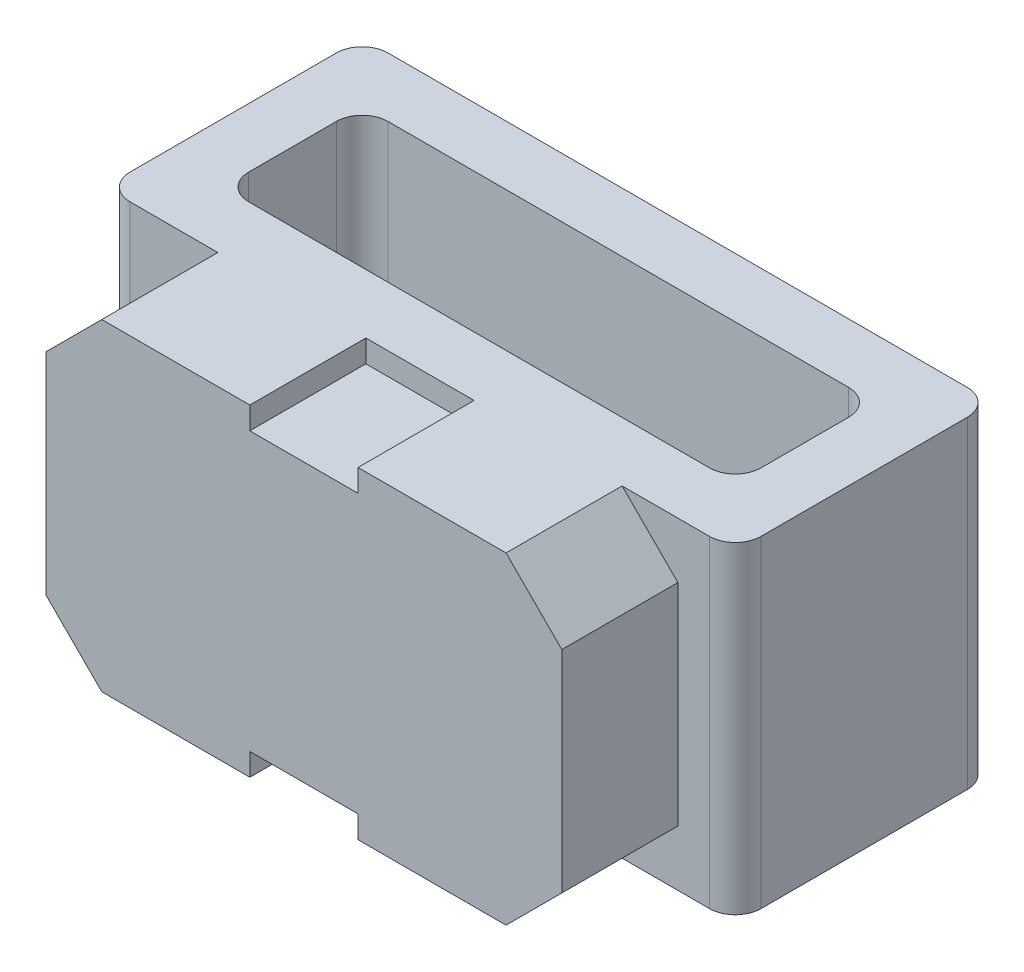
ISO-10303-21;
HEADER;
FILE_DESCRIPTION(('STEP AP214'),'2;1');
FILE_NAME('part.step','',(''),(''),'','','');
FILE_SCHEMA(('AUTOMOTIVE_DESIGN { 1 0 10303 214 1 1 1 1 }'));
ENDSEC;
DATA;
#1=APPLICATION_CONTEXT('core data for automotive mechanical design processes');
#2=APPLICATION_PROTOCOL_DEFINITION('international standard','automotive_design',2000,#1);
#3=PRODUCT_CONTEXT('',#1,'mechanical');
#4=PRODUCT('Part','Part','',(#3));
#5=PRODUCT_RELATED_PRODUCT_CATEGORY('part','',(#4));
#6=PRODUCT_DEFINITION_FORMATION('','',#4);
#7=PRODUCT_DEFINITION_CONTEXT('part definition',#1,'design');
#8=PRODUCT_DEFINITION('design','',#6,#7);
#9=PRODUCT_DEFINITION_SHAPE('','',#8);
#10=(LENGTH_UNIT() NAMED_UNIT(*) SI_UNIT(.MILLI.,.METRE.));
#11=(NAMED_UNIT(*) PLANE_ANGLE_UNIT() SI_UNIT($,.RADIAN.));
#12=(NAMED_UNIT(*) SI_UNIT($,.STERADIAN.) SOLID_ANGLE_UNIT());
#13=UNCERTAINTY_MEASURE_WITH_UNIT(LENGTH_MEASURE(1.E-05),#10,'distance_accuracy_value','');
#14=(GEOMETRIC_REPRESENTATION_CONTEXT(3) GLOBAL_UNCERTAINTY_ASSIGNED_CONTEXT((#13)) GLOBAL_UNIT_ASSIGNED_CONTEXT((#10,
#11,#12)) REPRESENTATION_CONTEXT('',''));
#15=CARTESIAN_POINT('',(0.,0.,0.));
#16=DIRECTION('',(0.,0.,1.));
#17=DIRECTION('',(1.,0.,0.));
#18=AXIS2_PLACEMENT_3D('',#15,#16,#17);
#19=CARTESIAN_POINT('',(0.209757082518002,0.625,0.45));
#20=DIRECTION('',(1.,0.,0.));
#21=DIRECTION('',(0.,1.,0.));
#22=AXIS2_PLACEMENT_3D('',#19,#20,#21);
#23=PLANE('',#22);
#24=DIRECTION('',(0.,-1.,0.));
#25=VECTOR('',#24,1.);
#26=CARTESIAN_POINT('',(0.209757082518002,0.625,0.));
#27=LINE('',#26,#25);
#28=CARTESIAN_POINT('',(0.209757082518002,0.625,0.));
#29=VERTEX_POINT('',#28);
#30=CARTESIAN_POINT('',(0.209757082518002,0.538272510111284,0.));
#31=VERTEX_POINT('',#30);
#32=EDGE_CURVE('E413',#29,#31,#27,.T.);
#33=ORIENTED_EDGE('',*,*,#32,.T.);
#34=DIRECTION('',(0.,0.,-1.));
#35=VECTOR('',#34,1.);
#36=CARTESIAN_POINT('',(0.209757082518002,0.538272510111284,0.45));
#37=LINE('',#36,#35);
#38=CARTESIAN_POINT('',(0.209757082518002,0.538272510111284,0.45));
#39=VERTEX_POINT('',#38);
#40=EDGE_CURVE('E293',#39,#31,#37,.T.);
#41=ORIENTED_EDGE('',*,*,#40,.F.);
#42=DIRECTION('',(0.,-1.,0.));
#43=VECTOR('',#42,1.);
#44=CARTESIAN_POINT('',(0.209757082518002,0.625,0.45));
#45=LINE('',#44,#43);
#46=CARTESIAN_POINT('',(0.209757082518002,0.625,0.45));
#47=VERTEX_POINT('',#46);
#48=EDGE_CURVE('E422',#47,#39,#45,.T.);
#49=ORIENTED_EDGE('',*,*,#48,.F.);
#50=DIRECTION('',(0.,0.,-1.));
#51=VECTOR('',#50,1.);
#52=CARTESIAN_POINT('',(0.209757082518002,0.625,0.45));
#53=LINE('',#52,#51);
#54=EDGE_CURVE('E455',#47,#29,#53,.T.);
#55=ORIENTED_EDGE('',*,*,#54,.T.);
#56=EDGE_LOOP('',(#33,#41,#49,#55));
#57=FACE_BOUND('',#56,.T.);
#58=ADVANCED_FACE('F33',(#57),#23,.F.);
#59=CARTESIAN_POINT('',(-0.209757082518002,0.538272510111284,0.45));
#60=DIRECTION('',(0.,-1.,0.));
#61=DIRECTION('',(0.,0.,-1.));
#62=AXIS2_PLACEMENT_3D('',#59,#60,#61);
#63=PLANE('',#62);
#64=DIRECTION('',(-1.,0.,0.));
#65=VECTOR('',#64,1.);
#66=CARTESIAN_POINT('',(-0.209757082518002,0.538272510111284,0.));
#67=LINE('',#66,#65);
#68=CARTESIAN_POINT('',(-0.209757082518002,0.538272510111284,0.));
#69=VERTEX_POINT('',#68);
#70=EDGE_CURVE('E458',#31,#69,#67,.T.);
#71=ORIENTED_EDGE('',*,*,#70,.T.);
#72=DIRECTION('',(0.,0.,-1.));
#73=VECTOR('',#72,1.);
#74=CARTESIAN_POINT('',(-0.209757082518002,0.538272510111284,0.45));
#75=LINE('',#74,#73);
#76=CARTESIAN_POINT('',(-0.209757082518002,0.538272510111284,0.45));
#77=VERTEX_POINT('',#76);
#78=EDGE_CURVE('E290',#77,#69,#75,.T.);
#79=ORIENTED_EDGE('',*,*,#78,.F.);
#80=DIRECTION('',(-1.,0.,0.));
#81=VECTOR('',#80,1.);
#82=CARTESIAN_POINT('',(-0.209757082518002,0.538272510111284,0.45));
#83=LINE('',#82,#81);
#84=EDGE_CURVE('E425',#39,#77,#83,.T.);
#85=ORIENTED_EDGE('',*,*,#84,.F.);
#86=ORIENTED_EDGE('',*,*,#40,.T.);
#87=EDGE_LOOP('',(#71,#79,#85,#86));
#88=FACE_BOUND('',#87,.T.);
#89=ADVANCED_FACE('F556',(#88),#63,.F.);
#90=CARTESIAN_POINT('',(-0.209757082518002,0.625,0.45));
#91=DIRECTION('',(-1.,0.,0.));
#92=DIRECTION('',(0.,-1.,0.));
#93=AXIS2_PLACEMENT_3D('',#90,#91,#92);
#94=PLANE('',#93);
#95=DIRECTION('',(0.,1.,0.));
#96=VECTOR('',#95,1.);
#97=CARTESIAN_POINT('',(-0.209757082518002,0.625,0.));
#98=LINE('',#97,#96);
#99=CARTESIAN_POINT('',(-0.209757082518002,0.625,0.));
#100=VERTEX_POINT('',#99);
#101=EDGE_CURVE('E461',#69,#100,#98,.T.);
#102=ORIENTED_EDGE('',*,*,#101,.T.);
#103=DIRECTION('',(0.,0.,-1.));
#104=VECTOR('',#103,1.);
#105=CARTESIAN_POINT('',(-0.209757082518002,0.625,0.45));
#106=LINE('',#105,#104);
#107=CARTESIAN_POINT('',(-0.209757082518002,0.625,0.45));
#108=VERTEX_POINT('',#107);
#109=EDGE_CURVE('E287',#108,#100,#106,.T.);
#110=ORIENTED_EDGE('',*,*,#109,.F.);
#111=DIRECTION('',(0.,1.,0.));
#112=VECTOR('',#111,1.);
#113=CARTESIAN_POINT('',(-0.209757082518002,0.625,0.45));
#114=LINE('',#113,#112);
#115=EDGE_CURVE('E428',#77,#108,#114,.T.);
#116=ORIENTED_EDGE('',*,*,#115,.F.);
#117=ORIENTED_EDGE('',*,*,#78,.T.);
#118=EDGE_LOOP('',(#102,#110,#116,#117));
#119=FACE_BOUND('',#118,.T.);
#120=ADVANCED_FACE('F563',(#119),#94,.F.);
#121=CARTESIAN_POINT('',(-1.,0.408686365069274,0.45));
#122=DIRECTION('',(0.707106781186546,-0.707106781186549,0.));
#123=DIRECTION('',(0.707106781186549,0.707106781186546,0.));
#124=AXIS2_PLACEMENT_3D('',#121,#122,#123);
#125=PLANE('',#124);
#126=DIRECTION('',(-0.707106781186549,-0.707106781186546,0.));
#127=VECTOR('',#126,1.);
#128=CARTESIAN_POINT('',(-1.,0.408686365069274,0.));
#129=LINE('',#128,#127);
#130=CARTESIAN_POINT('',(-0.783686365069273,0.625,0.));
#131=VERTEX_POINT('',#130);
#132=CARTESIAN_POINT('',(-1.,0.408686365069274,0.));
#133=VERTEX_POINT('',#132);
#134=EDGE_CURVE('E464',#131,#133,#129,.T.);
#135=ORIENTED_EDGE('',*,*,#134,.T.);
#136=DIRECTION('',(0.,0.,-1.));
#137=VECTOR('',#136,1.);
#138=CARTESIAN_POINT('',(-1.,0.408686365069274,0.45));
#139=LINE('',#138,#137);
#140=CARTESIAN_POINT('',(-1.,0.408686365069274,0.45));
#141=VERTEX_POINT('',#140);
#142=EDGE_CURVE('E275',#141,#133,#139,.T.);
#143=ORIENTED_EDGE('',*,*,#142,.F.);
#144=DIRECTION('',(-0.707106781186549,-0.707106781186546,0.));
#145=VECTOR('',#144,1.);
#146=CARTESIAN_POINT('',(-1.,0.408686365069274,0.45));
#147=LINE('',#146,#145);
#148=CARTESIAN_POINT('',(-0.783686365069273,0.625,0.45));
#149=VERTEX_POINT('',#148);
#150=EDGE_CURVE('E432',#149,#141,#147,.T.);
#151=ORIENTED_EDGE('',*,*,#150,.F.);
#152=DIRECTION('',(0.,0.,-1.));
#153=VECTOR('',#152,1.);
#154=CARTESIAN_POINT('',(-0.783686365069273,0.625,0.45));
#155=LINE('',#154,#153);
#156=EDGE_CURVE('E284',#149,#131,#155,.T.);
#157=ORIENTED_EDGE('',*,*,#156,.T.);
#158=EDGE_LOOP('',(#135,#143,#151,#157));
#159=FACE_BOUND('',#158,.T.);
#160=ADVANCED_FACE('F820',(#159),#125,.F.);
#161=CARTESIAN_POINT('',(-1.,-0.408686365069274,0.45));
#162=DIRECTION('',(1.,0.,0.));
#163=DIRECTION('',(0.,0.,-1.));
#164=AXIS2_PLACEMENT_3D('',#161,#162,#163);
#165=PLANE('',#164);
#166=DIRECTION('',(0.,-1.,0.));
#167=VECTOR('',#166,1.);
#168=CARTESIAN_POINT('',(-1.,-0.408686365069274,0.));
#169=LINE('',#168,#167);
#170=CARTESIAN_POINT('',(-1.,-0.408686365069274,0.));
#171=VERTEX_POINT('',#170);
#172=EDGE_CURVE('E266',#133,#171,#169,.T.);
#173=ORIENTED_EDGE('',*,*,#172,.T.);
#174=DIRECTION('',(0.,0.,-1.));
#175=VECTOR('',#174,1.);
#176=CARTESIAN_POINT('',(-1.,-0.408686365069274,0.45));
#177=LINE('',#176,#175);
#178=CARTESIAN_POINT('',(-1.,-0.408686365069274,0.45));
#179=VERTEX_POINT('',#178);
#180=EDGE_CURVE('E264',#179,#171,#177,.T.);
#181=ORIENTED_EDGE('',*,*,#180,.F.);
#182=DIRECTION('',(0.,-1.,0.));
#183=VECTOR('',#182,1.);
#184=CARTESIAN_POINT('',(-1.,-0.408686365069274,0.45));
#185=LINE('',#184,#183);
#186=EDGE_CURVE('E434',#141,#179,#185,.T.);
#187=ORIENTED_EDGE('',*,*,#186,.F.);
#188=ORIENTED_EDGE('',*,*,#142,.T.);
#189=EDGE_LOOP('',(#173,#181,#187,#188));
#190=FACE_BOUND('',#189,.T.);
#191=ADVANCED_FACE('F811',(#190),#165,.F.);
#192=CARTESIAN_POINT('',(-1.,-0.408686365069274,0.45));
#193=DIRECTION('',(0.707106781186546,0.707106781186549,0.));
#194=DIRECTION('',(-0.707106781186549,0.707106781186546,0.));
#195=AXIS2_PLACEMENT_3D('',#192,#193,#194);
#196=PLANE('',#195);
#197=DIRECTION('',(0.707106781186549,-0.707106781186546,0.));
#198=VECTOR('',#197,1.);
#199=CARTESIAN_POINT('',(-1.,-0.408686365069274,0.));
#200=LINE('',#199,#198);
#201=CARTESIAN_POINT('',(-0.783686365069273,-0.625,0.));
#202=VERTEX_POINT('',#201);
#203=EDGE_CURVE('E246',#171,#202,#200,.T.);
#204=ORIENTED_EDGE('',*,*,#203,.T.);
#205=DIRECTION('',(0.,0.,-1.));
#206=VECTOR('',#205,1.);
#207=CARTESIAN_POINT('',(-0.783686365069273,-0.625,0.45));
#208=LINE('',#207,#206);
#209=CARTESIAN_POINT('',(-0.783686365069273,-0.625,0.45));
#210=VERTEX_POINT('',#209);
#211=EDGE_CURVE('E261',#210,#202,#208,.T.);
#212=ORIENTED_EDGE('',*,*,#211,.F.);
#213=DIRECTION('',(0.707106781186549,-0.707106781186546,0.));
#214=VECTOR('',#213,1.);
#215=CARTESIAN_POINT('',(-1.,-0.408686365069274,0.45));
#216=LINE('',#215,#214);
#217=EDGE_CURVE('E436',#179,#210,#216,.T.);
#218=ORIENTED_EDGE('',*,*,#217,.F.);
#219=ORIENTED_EDGE('',*,*,#180,.T.);
#220=EDGE_LOOP('',(#204,#212,#218,#219));
#221=FACE_BOUND('',#220,.T.);
#222=ADVANCED_FACE('F259',(#221),#196,.F.);
#223=CARTESIAN_POINT('',(-0.209757082518002,-0.625,0.45));
#224=DIRECTION('',(-1.,0.,0.));
#225=DIRECTION('',(0.,-1.,0.));
#226=AXIS2_PLACEMENT_3D('',#223,#224,#225);
#227=PLANE('',#226);
#228=DIRECTION('',(0.,1.,0.));
#229=VECTOR('',#228,1.);
#230=CARTESIAN_POINT('',(-0.209757082518002,-0.625,0.));
#231=LINE('',#230,#229);
#232=CARTESIAN_POINT('',(-0.209757082518002,-0.625,0.));
#233=VERTEX_POINT('',#232);
#234=CARTESIAN_POINT('',(-0.209757082518002,-0.538272510111284,0.));
#235=VERTEX_POINT('',#234);
#236=EDGE_CURVE('E265',#233,#235,#231,.T.);
#237=ORIENTED_EDGE('',*,*,#236,.T.);
#238=DIRECTION('',(0.,0.,-1.));
#239=VECTOR('',#238,1.);
#240=CARTESIAN_POINT('',(-0.209757082518002,-0.538272510111284,0.45));
#241=LINE('',#240,#239);
#242=CARTESIAN_POINT('',(-0.209757082518002,-0.538272510111284,0.45));
#243=VERTEX_POINT('',#242);
#244=EDGE_CURVE('E278',#243,#235,#241,.T.);
#245=ORIENTED_EDGE('',*,*,#244,.F.);
#246=DIRECTION('',(0.,1.,0.));
#247=VECTOR('',#246,1.);
#248=CARTESIAN_POINT('',(-0.209757082518002,-0.625,0.45));
#249=LINE('',#248,#247);
#250=CARTESIAN_POINT('',(-0.209757082518002,-0.625,0.45));
#251=VERTEX_POINT('',#250);
#252=EDGE_CURVE('E439',#251,#243,#249,.T.);
#253=ORIENTED_EDGE('',*,*,#252,.F.);
#254=DIRECTION('',(0.,0.,-1.));
#255=VECTOR('',#254,1.);
#256=CARTESIAN_POINT('',(-0.209757082518002,-0.625,0.45));
#257=LINE('',#256,#255);
#258=EDGE_CURVE('E273',#251,#233,#257,.T.);
#259=ORIENTED_EDGE('',*,*,#258,.T.);
#260=EDGE_LOOP('',(#237,#245,#253,#259));
#261=FACE_BOUND('',#260,.T.);
#262=ADVANCED_FACE('F511',(#261),#227,.F.);
#263=CARTESIAN_POINT('',(-0.209757082518002,-0.538272510111284,0.45));
#264=DIRECTION('',(0.,1.,0.));
#265=DIRECTION('',(0.,0.,1.));
#266=AXIS2_PLACEMENT_3D('',#263,#264,#265);
#267=PLANE('',#266);
#268=DIRECTION('',(1.,0.,0.));
#269=VECTOR('',#268,1.);
#270=CARTESIAN_POINT('',(-0.209757082518002,-0.538272510111284,0.));
#271=LINE('',#270,#269);
#272=CARTESIAN_POINT('',(0.209757082518002,-0.538272510111284,0.));
#273=VERTEX_POINT('',#272);
#274=EDGE_CURVE('E470',#235,#273,#271,.T.);
#275=ORIENTED_EDGE('',*,*,#274,.T.);
#276=DIRECTION('',(0.,0.,-1.));
#277=VECTOR('',#276,1.);
#278=CARTESIAN_POINT('',(0.209757082518002,-0.538272510111284,0.45));
#279=LINE('',#278,#277);
#280=CARTESIAN_POINT('',(0.209757082518002,-0.538272510111284,0.45));
#281=VERTEX_POINT('',#280);
#282=EDGE_CURVE('E501',#281,#273,#279,.T.);
#283=ORIENTED_EDGE('',*,*,#282,.F.);
#284=DIRECTION('',(1.,0.,0.));
#285=VECTOR('',#284,1.);
#286=CARTESIAN_POINT('',(-0.209757082518002,-0.538272510111284,0.45));
#287=LINE('',#286,#285);
#288=EDGE_CURVE('E441',#243,#281,#287,.T.);
#289=ORIENTED_EDGE('',*,*,#288,.F.);
#290=ORIENTED_EDGE('',*,*,#244,.T.);
#291=EDGE_LOOP('',(#275,#283,#289,#290));
#292=FACE_BOUND('',#291,.T.);
#293=ADVANCED_FACE('F507',(#292),#267,.F.);
#294=CARTESIAN_POINT('',(0.209757082518002,-0.625,0.45));
#295=DIRECTION('',(1.,0.,0.));
#296=DIRECTION('',(0.,1.,0.));
#297=AXIS2_PLACEMENT_3D('',#294,#295,#296);
#298=PLANE('',#297);
#299=DIRECTION('',(0.,-1.,0.));
#300=VECTOR('',#299,1.);
#301=CARTESIAN_POINT('',(0.209757082518002,-0.625,0.));
#302=LINE('',#301,#300);
#303=CARTESIAN_POINT('',(0.209757082518002,-0.625,0.));
#304=VERTEX_POINT('',#303);
#305=EDGE_CURVE('E473',#273,#304,#302,.T.);
#306=ORIENTED_EDGE('',*,*,#305,.T.);
#307=DIRECTION('',(0.,0.,-1.));
#308=VECTOR('',#307,1.);
#309=CARTESIAN_POINT('',(0.209757082518002,-0.625,0.45));
#310=LINE('',#309,#308);
#311=CARTESIAN_POINT('',(0.209757082518002,-0.625,0.45));
#312=VERTEX_POINT('',#311);
#313=EDGE_CURVE('E498',#312,#304,#310,.T.);
#314=ORIENTED_EDGE('',*,*,#313,.F.);
#315=DIRECTION('',(0.,-1.,0.));
#316=VECTOR('',#315,1.);
#317=CARTESIAN_POINT('',(0.209757082518002,-0.625,0.45));
#318=LINE('',#317,#316);
#319=EDGE_CURVE('E443',#281,#312,#318,.T.);
#320=ORIENTED_EDGE('',*,*,#319,.F.);
#321=ORIENTED_EDGE('',*,*,#282,.T.);
#322=EDGE_LOOP('',(#306,#314,#320,#321));
#323=FACE_BOUND('',#322,.T.);
#324=ADVANCED_FACE('F727',(#323),#298,.F.);
#325=CARTESIAN_POINT('',(0.783686365069273,-0.625,0.45));
#326=DIRECTION('',(0.,1.,0.));
#327=DIRECTION('',(0.,0.,1.));
#328=AXIS2_PLACEMENT_3D('',#325,#326,#327);
#329=PLANE('',#328);
#330=DIRECTION('',(0.,0.,-1.));
#331=VECTOR('',#330,1.);
#332=CARTESIAN_POINT('',(1.22235346259188,-0.625,-1.));
#333=LINE('',#332,#331);
#334=CARTESIAN_POINT('',(1.22235346259188,-0.625,-0.1));
#335=VERTEX_POINT('',#334);
#336=CARTESIAN_POINT('',(1.22235346259188,-0.625,-0.9));
#337=VERTEX_POINT('',#336);
#338=EDGE_CURVE('E397',#335,#337,#333,.T.);
#339=ORIENTED_EDGE('',*,*,#338,.F.);
#340=CARTESIAN_POINT('',(1.12235346259188,-0.625,-0.1));
#341=DIRECTION('',(0.,1.,0.));
#342=DIRECTION('',(0.,0.,1.));
#343=AXIS2_PLACEMENT_3D('',#340,#341,#342);
#344=CIRCLE('',#343,0.1);
#345=CARTESIAN_POINT('',(1.12235346259188,-0.625,0.));
#346=VERTEX_POINT('',#345);
#347=EDGE_CURVE('E327',#335,#346,#344,.F.);
#348=ORIENTED_EDGE('',*,*,#347,.T.);
#349=DIRECTION('',(1.,0.,0.));
#350=VECTOR('',#349,1.);
#351=CARTESIAN_POINT('',(-1.22408520692018,-0.625,0.));
#352=LINE('',#351,#350);
#353=CARTESIAN_POINT('',(0.783686365069273,-0.625,0.));
#354=VERTEX_POINT('',#353);
#355=EDGE_CURVE('E255',#354,#346,#352,.T.);
#356=ORIENTED_EDGE('',*,*,#355,.F.);
#357=DIRECTION('',(0.,0.,-1.));
#358=VECTOR('',#357,1.);
#359=CARTESIAN_POINT('',(0.783686365069273,-0.625,0.45));
#360=LINE('',#359,#358);
#361=CARTESIAN_POINT('',(0.783686365069273,-0.625,0.45));
#362=VERTEX_POINT('',#361);
#363=EDGE_CURVE('E495',#362,#354,#360,.T.);
#364=ORIENTED_EDGE('',*,*,#363,.F.);
#365=DIRECTION('',(1.,0.,0.));
#366=VECTOR('',#365,1.);
#367=CARTESIAN_POINT('',(0.783686365069273,-0.625,0.45));
#368=LINE('',#367,#366);
#369=EDGE_CURVE('E445',#312,#362,#368,.T.);
#370=ORIENTED_EDGE('',*,*,#369,.F.);
#371=ORIENTED_EDGE('',*,*,#313,.T.);
#372=EDGE_CURVE('E253',#233,#304,#352,.T.);
#373=ORIENTED_EDGE('',*,*,#372,.F.);
#374=ORIENTED_EDGE('',*,*,#258,.F.);
#375=DIRECTION('',(1.,0.,0.));
#376=VECTOR('',#375,1.);
#377=CARTESIAN_POINT('',(-0.783686365069273,-0.625,0.45));
#378=LINE('',#377,#376);
#379=EDGE_CURVE('E272',#210,#251,#378,.T.);
#380=ORIENTED_EDGE('',*,*,#379,.F.);
#381=ORIENTED_EDGE('',*,*,#211,.T.);
#382=CARTESIAN_POINT('',(-1.12408520692018,-0.625,0.));
#383=VERTEX_POINT('',#382);
#384=EDGE_CURVE('E243',#383,#202,#352,.T.);
#385=ORIENTED_EDGE('',*,*,#384,.F.);
#386=CARTESIAN_POINT('',(-1.12408520692018,-0.625,-0.1));
#387=DIRECTION('',(0.,1.,0.));
#388=DIRECTION('',(0.,0.,1.));
#389=AXIS2_PLACEMENT_3D('',#386,#387,#388);
#390=CIRCLE('',#389,0.1);
#391=CARTESIAN_POINT('',(-1.22408520692018,-0.625,-0.1));
#392=VERTEX_POINT('',#391);
#393=EDGE_CURVE('E325',#383,#392,#390,.F.);
#394=ORIENTED_EDGE('',*,*,#393,.T.);
#395=DIRECTION('',(0.,0.,1.));
#396=VECTOR('',#395,1.);
#397=CARTESIAN_POINT('',(-1.22408520692018,-0.625,-1.));
#398=LINE('',#397,#396);
#399=CARTESIAN_POINT('',(-1.22408520692018,-0.625,-0.9));
#400=VERTEX_POINT('',#399);
#401=EDGE_CURVE('E420',#400,#392,#398,.T.);
#402=ORIENTED_EDGE('',*,*,#401,.F.);
#403=CARTESIAN_POINT('',(-1.12408520692018,-0.625,-0.9));
#404=DIRECTION('',(0.,1.,0.));
#405=DIRECTION('',(0.,0.,1.));
#406=AXIS2_PLACEMENT_3D('',#403,#404,#405);
#407=CIRCLE('',#406,0.1);
#408=CARTESIAN_POINT('',(-1.12408520692018,-0.625,-1.));
#409=VERTEX_POINT('',#408);
#410=EDGE_CURVE('E323',#400,#409,#407,.F.);
#411=ORIENTED_EDGE('',*,*,#410,.T.);
#412=DIRECTION('',(-1.,0.,0.));
#413=VECTOR('',#412,1.);
#414=CARTESIAN_POINT('',(-1.22408520692018,-0.625,-1.));
#415=LINE('',#414,#413);
#416=CARTESIAN_POINT('',(1.12235346259188,-0.625,-1.));
#417=VERTEX_POINT('',#416);
#418=EDGE_CURVE('E417',#417,#409,#415,.T.);
#419=ORIENTED_EDGE('',*,*,#418,.F.);
#420=CARTESIAN_POINT('',(1.12235346259188,-0.625,-0.9));
#421=DIRECTION('',(0.,1.,0.));
#422=DIRECTION('',(0.,0.,1.));
#423=AXIS2_PLACEMENT_3D('',#420,#421,#422);
#424=CIRCLE('',#423,0.1);
#425=EDGE_CURVE('E321',#417,#337,#424,.F.);
#426=ORIENTED_EDGE('',*,*,#425,.T.);
#427=EDGE_LOOP('',(#339,#348,#356,#364,#370,#371,#373,#374,#380,#381,#385,#394,#402,#411,#419,#426));
#428=FACE_BOUND('',#427,.T.);
#429=DIRECTION('',(1.,0.,0.));
#430=VECTOR('',#429,1.);
#431=CARTESIAN_POINT('',(-0.994085206920182,-0.625,-0.23));
#432=LINE('',#431,#430);
#433=CARTESIAN_POINT('',(-0.894085206920182,-0.625,-0.23));
#434=VERTEX_POINT('',#433);
#435=CARTESIAN_POINT('',(0.892353462591878,-0.625,-0.23));
#436=VERTEX_POINT('',#435);
#437=EDGE_CURVE('E374',#434,#436,#432,.T.);
#438=ORIENTED_EDGE('',*,*,#437,.T.);
#439=CARTESIAN_POINT('',(0.892353462591878,-0.625,-0.33));
#440=DIRECTION('',(0.,1.,0.));
#441=DIRECTION('',(0.,0.,1.));
#442=AXIS2_PLACEMENT_3D('',#439,#440,#441);
#443=CIRCLE('',#442,0.1);
#444=CARTESIAN_POINT('',(0.992353462591878,-0.625,-0.33));
#445=VERTEX_POINT('',#444);
#446=EDGE_CURVE('E352',#436,#445,#443,.T.);
#447=ORIENTED_EDGE('',*,*,#446,.T.);
#448=DIRECTION('',(0.,0.,-1.));
#449=VECTOR('',#448,1.);
#450=CARTESIAN_POINT('',(0.992353462591878,-0.625,-0.77));
#451=LINE('',#450,#449);
#452=CARTESIAN_POINT('',(0.992353462591878,-0.625,-0.67));
#453=VERTEX_POINT('',#452);
#454=EDGE_CURVE('E398',#445,#453,#451,.T.);
#455=ORIENTED_EDGE('',*,*,#454,.T.);
#456=CARTESIAN_POINT('',(0.892353462591878,-0.625,-0.67));
#457=DIRECTION('',(0.,1.,0.));
#458=DIRECTION('',(0.,0.,1.));
#459=AXIS2_PLACEMENT_3D('',#456,#457,#458);
#460=CIRCLE('',#459,0.1);
#461=CARTESIAN_POINT('',(0.892353462591878,-0.625,-0.77));
#462=VERTEX_POINT('',#461);
#463=EDGE_CURVE('E356',#453,#462,#460,.T.);
#464=ORIENTED_EDGE('',*,*,#463,.T.);
#465=DIRECTION('',(-1.,0.,0.));
#466=VECTOR('',#465,1.);
#467=CARTESIAN_POINT('',(-0.994085206920182,-0.625,-0.77));
#468=LINE('',#467,#466);
#469=CARTESIAN_POINT('',(-0.894085206920182,-0.625,-0.77));
#470=VERTEX_POINT('',#469);
#471=EDGE_CURVE('E365',#462,#470,#468,.T.);
#472=ORIENTED_EDGE('',*,*,#471,.T.);
#473=CARTESIAN_POINT('',(-0.894085206920182,-0.625,-0.67));
#474=DIRECTION('',(0.,1.,0.));
#475=DIRECTION('',(0.,0.,1.));
#476=AXIS2_PLACEMENT_3D('',#473,#474,#475);
#477=CIRCLE('',#476,0.1);
#478=CARTESIAN_POINT('',(-0.994085206920182,-0.625,-0.67));
#479=VERTEX_POINT('',#478);
#480=EDGE_CURVE('E41',#470,#479,#477,.T.);
#481=ORIENTED_EDGE('',*,*,#480,.T.);
#482=DIRECTION('',(0.,0.,1.));
#483=VECTOR('',#482,1.);
#484=CARTESIAN_POINT('',(-0.994085206920182,-0.625,-0.77));
#485=LINE('',#484,#483);
#486=CARTESIAN_POINT('',(-0.994085206920182,-0.625,-0.33));
#487=VERTEX_POINT('',#486);
#488=EDGE_CURVE('E363',#479,#487,#485,.T.);
#489=ORIENTED_EDGE('',*,*,#488,.T.);
#490=CARTESIAN_POINT('',(-0.894085206920182,-0.625,-0.33));
#491=DIRECTION('',(0.,1.,0.));
#492=DIRECTION('',(0.,0.,1.));
#493=AXIS2_PLACEMENT_3D('',#490,#491,#492);
#494=CIRCLE('',#493,0.1);
#495=EDGE_CURVE('E348',#487,#434,#494,.T.);
#496=ORIENTED_EDGE('',*,*,#495,.T.);
#497=EDGE_LOOP('',(#438,#447,#455,#464,#472,#481,#489,#496));
#498=FACE_BOUND('',#497,.T.);
#499=ADVANCED_FACE('F269',(#428,#498),#329,.F.);
#500=CARTESIAN_POINT('',(1.,-0.408686365069274,0.45));
#501=DIRECTION('',(-0.707106781186546,0.707106781186549,0.));
#502=DIRECTION('',(-0.707106781186549,-0.707106781186546,0.));
#503=AXIS2_PLACEMENT_3D('',#500,#501,#502);
#504=PLANE('',#503);
#505=DIRECTION('',(0.707106781186549,0.707106781186546,0.));
#506=VECTOR('',#505,1.);
#507=CARTESIAN_POINT('',(1.,-0.408686365069274,0.));
#508=LINE('',#507,#506);
#509=CARTESIAN_POINT('',(1.,-0.408686365069274,0.));
#510=VERTEX_POINT('',#509);
#511=EDGE_CURVE('E476',#354,#510,#508,.T.);
#512=ORIENTED_EDGE('',*,*,#511,.T.);
#513=DIRECTION('',(0.,0.,-1.));
#514=VECTOR('',#513,1.);
#515=CARTESIAN_POINT('',(1.,-0.408686365069274,0.45));
#516=LINE('',#515,#514);
#517=CARTESIAN_POINT('',(1.,-0.408686365069274,0.45));
#518=VERTEX_POINT('',#517);
#519=EDGE_CURVE('E492',#518,#510,#516,.T.);
#520=ORIENTED_EDGE('',*,*,#519,.F.);
#521=DIRECTION('',(0.707106781186549,0.707106781186546,0.));
#522=VECTOR('',#521,1.);
#523=CARTESIAN_POINT('',(1.,-0.408686365069274,0.45));
#524=LINE('',#523,#522);
#525=EDGE_CURVE('E447',#362,#518,#524,.T.);
#526=ORIENTED_EDGE('',*,*,#525,.F.);
#527=ORIENTED_EDGE('',*,*,#363,.T.);
#528=EDGE_LOOP('',(#512,#520,#526,#527));
#529=FACE_BOUND('',#528,.T.);
#530=ADVANCED_FACE('F726',(#529),#504,.F.);
#531=CARTESIAN_POINT('',(1.,-0.408686365069274,0.45));
#532=DIRECTION('',(-1.,0.,0.));
#533=DIRECTION('',(0.,0.,1.));
#534=AXIS2_PLACEMENT_3D('',#531,#532,#533);
#535=PLANE('',#534);
#536=DIRECTION('',(0.,1.,0.));
#537=VECTOR('',#536,1.);
#538=CARTESIAN_POINT('',(1.,-0.408686365069274,0.));
#539=LINE('',#538,#537);
#540=CARTESIAN_POINT('',(1.,0.408686365069274,0.));
#541=VERTEX_POINT('',#540);
#542=EDGE_CURVE('E479',#510,#541,#539,.T.);
#543=ORIENTED_EDGE('',*,*,#542,.T.);
#544=DIRECTION('',(0.,0.,-1.));
#545=VECTOR('',#544,1.);
#546=CARTESIAN_POINT('',(1.,0.408686365069274,0.45));
#547=LINE('',#546,#545);
#548=CARTESIAN_POINT('',(1.,0.408686365069274,0.45));
#549=VERTEX_POINT('',#548);
#550=EDGE_CURVE('E489',#549,#541,#547,.T.);
#551=ORIENTED_EDGE('',*,*,#550,.F.);
#552=DIRECTION('',(0.,1.,0.));
#553=VECTOR('',#552,1.);
#554=CARTESIAN_POINT('',(1.,-0.408686365069274,0.45));
#555=LINE('',#554,#553);
#556=EDGE_CURVE('E449',#518,#549,#555,.T.);
#557=ORIENTED_EDGE('',*,*,#556,.F.);
#558=ORIENTED_EDGE('',*,*,#519,.T.);
#559=EDGE_LOOP('',(#543,#551,#557,#558));
#560=FACE_BOUND('',#559,.T.);
#561=ADVANCED_FACE('F758',(#560),#535,.F.);
#562=CARTESIAN_POINT('',(1.,0.408686365069274,0.45));
#563=DIRECTION('',(-0.707106781186546,-0.707106781186549,0.));
#564=DIRECTION('',(0.707106781186549,-0.707106781186546,0.));
#565=AXIS2_PLACEMENT_3D('',#562,#563,#564);
#566=PLANE('',#565);
#567=DIRECTION('',(-0.707106781186549,0.707106781186546,0.));
#568=VECTOR('',#567,1.);
#569=CARTESIAN_POINT('',(1.,0.408686365069274,0.));
#570=LINE('',#569,#568);
#571=CARTESIAN_POINT('',(0.783686365069273,0.625,0.));
#572=VERTEX_POINT('',#571);
#573=EDGE_CURVE('E426',#541,#572,#570,.T.);
#574=ORIENTED_EDGE('',*,*,#573,.T.);
#575=DIRECTION('',(0.,0.,-1.));
#576=VECTOR('',#575,1.);
#577=CARTESIAN_POINT('',(0.783686365069273,0.625,0.45));
#578=LINE('',#577,#576);
#579=CARTESIAN_POINT('',(0.783686365069273,0.625,0.45));
#580=VERTEX_POINT('',#579);
#581=EDGE_CURVE('E486',#580,#572,#578,.T.);
#582=ORIENTED_EDGE('',*,*,#581,.F.);
#583=DIRECTION('',(-0.707106781186549,0.707106781186546,0.));
#584=VECTOR('',#583,1.);
#585=CARTESIAN_POINT('',(1.,0.408686365069274,0.45));
#586=LINE('',#585,#584);
#587=EDGE_CURVE('E451',#549,#580,#586,.T.);
#588=ORIENTED_EDGE('',*,*,#587,.F.);
#589=ORIENTED_EDGE('',*,*,#550,.T.);
#590=EDGE_LOOP('',(#574,#582,#588,#589));
#591=FACE_BOUND('',#590,.T.);
#592=ADVANCED_FACE('F716',(#591),#566,.F.);
#593=CARTESIAN_POINT('',(0.783686365069273,0.625,0.45));
#594=DIRECTION('',(0.,-1.,0.));
#595=DIRECTION('',(0.,0.,-1.));
#596=AXIS2_PLACEMENT_3D('',#593,#594,#595);
#597=PLANE('',#596);
#598=DIRECTION('',(1.,0.,0.));
#599=VECTOR('',#598,1.);
#600=CARTESIAN_POINT('',(-1.22408520692018,0.625,0.));
#601=LINE('',#600,#599);
#602=CARTESIAN_POINT('',(1.12235346259188,0.625,0.));
#603=VERTEX_POINT('',#602);
#604=EDGE_CURVE('E410',#572,#603,#601,.T.);
#605=ORIENTED_EDGE('',*,*,#604,.T.);
#606=CARTESIAN_POINT('',(1.12235346259188,0.625,-0.1));
#607=DIRECTION('',(0.,-1.,0.));
#608=DIRECTION('',(0.,0.,-1.));
#609=AXIS2_PLACEMENT_3D('',#606,#607,#608);
#610=CIRCLE('',#609,0.1);
#611=CARTESIAN_POINT('',(1.22235346259188,0.625,-0.1));
#612=VERTEX_POINT('',#611);
#613=EDGE_CURVE('E336',#603,#612,#610,.F.);
#614=ORIENTED_EDGE('',*,*,#613,.T.);
#615=DIRECTION('',(0.,0.,-1.));
#616=VECTOR('',#615,1.);
#617=CARTESIAN_POINT('',(1.22235346259188,0.625,-1.));
#618=LINE('',#617,#616);
#619=CARTESIAN_POINT('',(1.22235346259188,0.625,-0.9));
#620=VERTEX_POINT('',#619);
#621=EDGE_CURVE('E252',#612,#620,#618,.T.);
#622=ORIENTED_EDGE('',*,*,#621,.T.);
#623=CARTESIAN_POINT('',(1.12235346259188,0.625,-0.9));
#624=DIRECTION('',(0.,-1.,0.));
#625=DIRECTION('',(0.,0.,-1.));
#626=AXIS2_PLACEMENT_3D('',#623,#624,#625);
#627=CIRCLE('',#626,0.1);
#628=CARTESIAN_POINT('',(1.12235346259188,0.625,-1.));
#629=VERTEX_POINT('',#628);
#630=EDGE_CURVE('E331',#620,#629,#627,.F.);
#631=ORIENTED_EDGE('',*,*,#630,.T.);
#632=DIRECTION('',(-1.,0.,0.));
#633=VECTOR('',#632,1.);
#634=CARTESIAN_POINT('',(-1.22408520692018,0.625,-1.));
#635=LINE('',#634,#633);
#636=CARTESIAN_POINT('',(-1.12408520692018,0.625,-1.));
#637=VERTEX_POINT('',#636);
#638=EDGE_CURVE('E405',#629,#637,#635,.T.);
#639=ORIENTED_EDGE('',*,*,#638,.T.);
#640=CARTESIAN_POINT('',(-1.12408520692018,0.625,-0.9));
#641=DIRECTION('',(0.,-1.,0.));
#642=DIRECTION('',(0.,0.,-1.));
#643=AXIS2_PLACEMENT_3D('',#640,#641,#642);
#644=CIRCLE('',#643,0.1);
#645=CARTESIAN_POINT('',(-1.22408520692018,0.625,-0.9));
#646=VERTEX_POINT('',#645);
#647=EDGE_CURVE('E333',#637,#646,#644,.F.);
#648=ORIENTED_EDGE('',*,*,#647,.T.);
#649=DIRECTION('',(0.,0.,1.));
#650=VECTOR('',#649,1.);
#651=CARTESIAN_POINT('',(-1.22408520692018,0.625,-1.));
#652=LINE('',#651,#650);
#653=CARTESIAN_POINT('',(-1.22408520692018,0.625,-0.1));
#654=VERTEX_POINT('',#653);
#655=EDGE_CURVE('E408',#646,#654,#652,.T.);
#656=ORIENTED_EDGE('',*,*,#655,.T.);
#657=CARTESIAN_POINT('',(-1.12408520692018,0.625,-0.1));
#658=DIRECTION('',(0.,-1.,0.));
#659=DIRECTION('',(0.,0.,-1.));
#660=AXIS2_PLACEMENT_3D('',#657,#658,#659);
#661=CIRCLE('',#660,0.1);
#662=CARTESIAN_POINT('',(-1.12408520692018,0.625,0.));
#663=VERTEX_POINT('',#662);
#664=EDGE_CURVE('E48',#654,#663,#661,.F.);
#665=ORIENTED_EDGE('',*,*,#664,.T.);
#666=EDGE_CURVE('E411',#663,#131,#601,.T.);
#667=ORIENTED_EDGE('',*,*,#666,.T.);
#668=ORIENTED_EDGE('',*,*,#156,.F.);
#669=DIRECTION('',(-1.,0.,0.));
#670=VECTOR('',#669,1.);
#671=CARTESIAN_POINT('',(-0.783686365069273,0.625,0.45));
#672=LINE('',#671,#670);
#673=EDGE_CURVE('E430',#108,#149,#672,.T.);
#674=ORIENTED_EDGE('',*,*,#673,.F.);
#675=ORIENTED_EDGE('',*,*,#109,.T.);
#676=EDGE_CURVE('E414',#100,#29,#601,.T.);
#677=ORIENTED_EDGE('',*,*,#676,.T.);
#678=ORIENTED_EDGE('',*,*,#54,.F.);
#679=DIRECTION('',(-1.,0.,0.));
#680=VECTOR('',#679,1.);
#681=CARTESIAN_POINT('',(0.783686365069273,0.625,0.45));
#682=LINE('',#681,#680);
#683=EDGE_CURVE('E453',#580,#47,#682,.T.);
#684=ORIENTED_EDGE('',*,*,#683,.F.);
#685=ORIENTED_EDGE('',*,*,#581,.T.);
#686=EDGE_LOOP('',(#605,#614,#622,#631,#639,#648,#656,#665,#667,#668,#674,#675,#677,#678,#684,#685));
#687=FACE_BOUND('',#686,.T.);
#688=DIRECTION('',(-1.,0.,0.));
#689=VECTOR('',#688,1.);
#690=CARTESIAN_POINT('',(-0.994085206920182,0.625,-0.77));
#691=LINE('',#690,#689);
#692=CARTESIAN_POINT('',(0.892353462591878,0.625,-0.77));
#693=VERTEX_POINT('',#692);
#694=CARTESIAN_POINT('',(-0.894085206920182,0.625,-0.77));
#695=VERTEX_POINT('',#694);
#696=EDGE_CURVE('E382',#693,#695,#691,.T.);
#697=ORIENTED_EDGE('',*,*,#696,.F.);
#698=CARTESIAN_POINT('',(0.892353462591878,0.625,-0.67));
#699=DIRECTION('',(0.,-1.,0.));
#700=DIRECTION('',(0.,0.,-1.));
#701=AXIS2_PLACEMENT_3D('',#698,#699,#700);
#702=CIRCLE('',#701,0.1);
#703=CARTESIAN_POINT('',(0.992353462591878,0.625,-0.67));
#704=VERTEX_POINT('',#703);
#705=EDGE_CURVE('E358',#693,#704,#702,.T.);
#706=ORIENTED_EDGE('',*,*,#705,.T.);
#707=DIRECTION('',(0.,0.,-1.));
#708=VECTOR('',#707,1.);
#709=CARTESIAN_POINT('',(0.992353462591878,0.625,-0.77));
#710=LINE('',#709,#708);
#711=CARTESIAN_POINT('',(0.992353462591878,0.625,-0.33));
#712=VERTEX_POINT('',#711);
#713=EDGE_CURVE('E388',#712,#704,#710,.T.);
#714=ORIENTED_EDGE('',*,*,#713,.F.);
#715=CARTESIAN_POINT('',(0.892353462591878,0.625,-0.33));
#716=DIRECTION('',(0.,-1.,0.));
#717=DIRECTION('',(0.,0.,-1.));
#718=AXIS2_PLACEMENT_3D('',#715,#716,#717);
#719=CIRCLE('',#718,0.1);
#720=CARTESIAN_POINT('',(0.892353462591878,0.625,-0.23));
#721=VERTEX_POINT('',#720);
#722=EDGE_CURVE('E354',#712,#721,#719,.T.);
#723=ORIENTED_EDGE('',*,*,#722,.T.);
#724=DIRECTION('',(1.,0.,0.));
#725=VECTOR('',#724,1.);
#726=CARTESIAN_POINT('',(-0.994085206920182,0.625,-0.23));
#727=LINE('',#726,#725);
#728=CARTESIAN_POINT('',(-0.894085206920182,0.625,-0.23));
#729=VERTEX_POINT('',#728);
#730=EDGE_CURVE('E390',#729,#721,#727,.T.);
#731=ORIENTED_EDGE('',*,*,#730,.F.);
#732=CARTESIAN_POINT('',(-0.894085206920182,0.625,-0.33));
#733=DIRECTION('',(0.,-1.,0.));
#734=DIRECTION('',(0.,0.,-1.));
#735=AXIS2_PLACEMENT_3D('',#732,#733,#734);
#736=CIRCLE('',#735,0.1);
#737=CARTESIAN_POINT('',(-0.994085206920182,0.625,-0.33));
#738=VERTEX_POINT('',#737);
#739=EDGE_CURVE('E350',#729,#738,#736,.T.);
#740=ORIENTED_EDGE('',*,*,#739,.T.);
#741=DIRECTION('',(0.,0.,1.));
#742=VECTOR('',#741,1.);
#743=CARTESIAN_POINT('',(-0.994085206920182,0.625,-0.77));
#744=LINE('',#743,#742);
#745=CARTESIAN_POINT('',(-0.994085206920182,0.625,-0.67));
#746=VERTEX_POINT('',#745);
#747=EDGE_CURVE('E384',#746,#738,#744,.T.);
#748=ORIENTED_EDGE('',*,*,#747,.F.);
#749=CARTESIAN_POINT('',(-0.894085206920182,0.625,-0.67));
#750=DIRECTION('',(0.,-1.,0.));
#751=DIRECTION('',(0.,0.,-1.));
#752=AXIS2_PLACEMENT_3D('',#749,#750,#751);
#753=CIRCLE('',#752,0.1);
#754=EDGE_CURVE('E11',#746,#695,#753,.T.);
#755=ORIENTED_EDGE('',*,*,#754,.T.);
#756=EDGE_LOOP('',(#697,#706,#714,#723,#731,#740,#748,#755));
#757=FACE_BOUND('',#756,.T.);
#758=ADVANCED_FACE('F381',(#687,#757),#597,.F.);
#759=CARTESIAN_POINT('',(0.,0.,0.45));
#760=DIRECTION('',(0.,0.,1.));
#761=DIRECTION('',(1.,0.,0.));
#762=AXIS2_PLACEMENT_3D('',#759,#760,#761);
#763=PLANE('',#762);
#764=ORIENTED_EDGE('',*,*,#48,.T.);
#765=ORIENTED_EDGE('',*,*,#84,.T.);
#766=ORIENTED_EDGE('',*,*,#115,.T.);
#767=ORIENTED_EDGE('',*,*,#673,.T.);
#768=ORIENTED_EDGE('',*,*,#150,.T.);
#769=ORIENTED_EDGE('',*,*,#186,.T.);
#770=ORIENTED_EDGE('',*,*,#217,.T.);
#771=ORIENTED_EDGE('',*,*,#379,.T.);
#772=ORIENTED_EDGE('',*,*,#252,.T.);
#773=ORIENTED_EDGE('',*,*,#288,.T.);
#774=ORIENTED_EDGE('',*,*,#319,.T.);
#775=ORIENTED_EDGE('',*,*,#369,.T.);
#776=ORIENTED_EDGE('',*,*,#525,.T.);
#777=ORIENTED_EDGE('',*,*,#556,.T.);
#778=ORIENTED_EDGE('',*,*,#587,.T.);
#779=ORIENTED_EDGE('',*,*,#683,.T.);
#780=EDGE_LOOP('',(#764,#765,#766,#767,#768,#769,#770,#771,#772,#773,#774,#775,#776,#777,#778,#779));
#781=FACE_BOUND('',#780,.T.);
#782=ADVANCED_FACE('F708',(#781),#763,.T.);
#783=CARTESIAN_POINT('',(-1.22408520692018,0.625,0.));
#784=DIRECTION('',(0.,0.,-1.));
#785=DIRECTION('',(-1.,0.,0.));
#786=AXIS2_PLACEMENT_3D('',#783,#784,#785);
#787=PLANE('',#786);
#788=ORIENTED_EDGE('',*,*,#355,.T.);
#789=DIRECTION('',(0.,-1.,0.));
#790=VECTOR('',#789,1.);
#791=CARTESIAN_POINT('',(1.12235346259188,0.625,0.));
#792=LINE('',#791,#790);
#793=EDGE_CURVE('E329',#346,#603,#792,.F.);
#794=ORIENTED_EDGE('',*,*,#793,.T.);
#795=ORIENTED_EDGE('',*,*,#604,.F.);
#796=ORIENTED_EDGE('',*,*,#573,.F.);
#797=ORIENTED_EDGE('',*,*,#542,.F.);
#798=ORIENTED_EDGE('',*,*,#511,.F.);
#799=EDGE_LOOP('',(#788,#794,#795,#796,#797,#798));
#800=FACE_BOUND('',#799,.T.);
#801=ADVANCED_FACE('F521',(#800),#787,.F.);
#802=ORIENTED_EDGE('',*,*,#305,.F.);
#803=ORIENTED_EDGE('',*,*,#274,.F.);
#804=ORIENTED_EDGE('',*,*,#236,.F.);
#805=ORIENTED_EDGE('',*,*,#372,.T.);
#806=EDGE_LOOP('',(#802,#803,#804,#805));
#807=FACE_BOUND('',#806,.T.);
#808=ADVANCED_FACE('F514',(#807),#787,.F.);
#809=ORIENTED_EDGE('',*,*,#666,.F.);
#810=DIRECTION('',(0.,-1.,0.));
#811=VECTOR('',#810,1.);
#812=CARTESIAN_POINT('',(-1.12408520692018,0.625,0.));
#813=LINE('',#812,#811);
#814=EDGE_CURVE('E249',#663,#383,#813,.T.);
#815=ORIENTED_EDGE('',*,*,#814,.T.);
#816=ORIENTED_EDGE('',*,*,#384,.T.);
#817=ORIENTED_EDGE('',*,*,#203,.F.);
#818=ORIENTED_EDGE('',*,*,#172,.F.);
#819=ORIENTED_EDGE('',*,*,#134,.F.);
#820=EDGE_LOOP('',(#809,#815,#816,#817,#818,#819));
#821=FACE_BOUND('',#820,.T.);
#822=ADVANCED_FACE('F245',(#821),#787,.F.);
#823=CARTESIAN_POINT('',(1.22235346259188,0.625,-1.));
#824=DIRECTION('',(-1.,0.,0.));
#825=DIRECTION('',(0.,0.,1.));
#826=AXIS2_PLACEMENT_3D('',#823,#824,#825);
#827=PLANE('',#826);
#828=ORIENTED_EDGE('',*,*,#621,.F.);
#829=DIRECTION('',(0.,-1.,0.));
#830=VECTOR('',#829,1.);
#831=CARTESIAN_POINT('',(1.22235346259188,0.625,-0.1));
#832=LINE('',#831,#830);
#833=EDGE_CURVE('E318',#612,#335,#832,.T.);
#834=ORIENTED_EDGE('',*,*,#833,.T.);
#835=ORIENTED_EDGE('',*,*,#338,.T.);
#836=DIRECTION('',(0.,-1.,0.));
#837=VECTOR('',#836,1.);
#838=CARTESIAN_POINT('',(1.22235346259188,0.625,-0.9));
#839=LINE('',#838,#837);
#840=EDGE_CURVE('E316',#337,#620,#839,.F.);
#841=ORIENTED_EDGE('',*,*,#840,.T.);
#842=EDGE_LOOP('',(#828,#834,#835,#841));
#843=FACE_BOUND('',#842,.T.);
#844=ADVANCED_FACE('F531',(#843),#827,.F.);
#845=CARTESIAN_POINT('',(-1.22408520692018,0.625,-1.));
#846=DIRECTION('',(0.,0.,1.));
#847=DIRECTION('',(1.,0.,0.));
#848=AXIS2_PLACEMENT_3D('',#845,#846,#847);
#849=PLANE('',#848);
#850=ORIENTED_EDGE('',*,*,#418,.T.);
#851=DIRECTION('',(0.,-1.,0.));
#852=VECTOR('',#851,1.);
#853=CARTESIAN_POINT('',(-1.12408520692018,0.625,-1.));
#854=LINE('',#853,#852);
#855=EDGE_CURVE('E346',#409,#637,#854,.F.);
#856=ORIENTED_EDGE('',*,*,#855,.T.);
#857=ORIENTED_EDGE('',*,*,#638,.F.);
#858=DIRECTION('',(0.,-1.,0.));
#859=VECTOR('',#858,1.);
#860=CARTESIAN_POINT('',(1.12235346259188,0.625,-1.));
#861=LINE('',#860,#859);
#862=EDGE_CURVE('E343',#629,#417,#861,.T.);
#863=ORIENTED_EDGE('',*,*,#862,.T.);
#864=EDGE_LOOP('',(#850,#856,#857,#863));
#865=FACE_BOUND('',#864,.T.);
#866=ADVANCED_FACE('F538',(#865),#849,.F.);
#867=CARTESIAN_POINT('',(-1.22408520692018,0.625,-1.));
#868=DIRECTION('',(1.,0.,0.));
#869=DIRECTION('',(0.,0.,-1.));
#870=AXIS2_PLACEMENT_3D('',#867,#868,#869);
#871=PLANE('',#870);
#872=ORIENTED_EDGE('',*,*,#401,.T.);
#873=DIRECTION('',(0.,-1.,0.));
#874=VECTOR('',#873,1.);
#875=CARTESIAN_POINT('',(-1.22408520692018,0.625,-0.1));
#876=LINE('',#875,#874);
#877=EDGE_CURVE('E56',#392,#654,#876,.F.);
#878=ORIENTED_EDGE('',*,*,#877,.T.);
#879=ORIENTED_EDGE('',*,*,#655,.F.);
#880=DIRECTION('',(0.,-1.,0.));
#881=VECTOR('',#880,1.);
#882=CARTESIAN_POINT('',(-1.22408520692018,0.625,-0.9));
#883=LINE('',#882,#881);
#884=EDGE_CURVE('E339',#646,#400,#883,.T.);
#885=ORIENTED_EDGE('',*,*,#884,.T.);
#886=EDGE_LOOP('',(#872,#878,#879,#885));
#887=FACE_BOUND('',#886,.T.);
#888=ADVANCED_FACE('F544',(#887),#871,.F.);
#889=ORIENTED_EDGE('',*,*,#32,.F.);
#890=ORIENTED_EDGE('',*,*,#676,.F.);
#891=ORIENTED_EDGE('',*,*,#101,.F.);
#892=ORIENTED_EDGE('',*,*,#70,.F.);
#893=EDGE_LOOP('',(#889,#890,#891,#892));
#894=FACE_BOUND('',#893,.T.);
#895=ADVANCED_FACE('F656',(#894),#787,.F.);
#896=CARTESIAN_POINT('',(0.992353462591878,0.625,-0.77));
#897=DIRECTION('',(-1.,0.,0.));
#898=DIRECTION('',(0.,0.,1.));
#899=AXIS2_PLACEMENT_3D('',#896,#897,#898);
#900=PLANE('',#899);
#901=ORIENTED_EDGE('',*,*,#454,.F.);
#902=DIRECTION('',(0.,-1.,0.));
#903=VECTOR('',#902,1.);
#904=CARTESIAN_POINT('',(0.992353462591878,0.625,-0.33));
#905=LINE('',#904,#903);
#906=EDGE_CURVE('E309',#445,#712,#905,.F.);
#907=ORIENTED_EDGE('',*,*,#906,.T.);
#908=ORIENTED_EDGE('',*,*,#713,.T.);
#909=DIRECTION('',(0.,-1.,0.));
#910=VECTOR('',#909,1.);
#911=CARTESIAN_POINT('',(0.992353462591878,-0.625,-0.67));
#912=LINE('',#911,#910);
#913=EDGE_CURVE('E306',#704,#453,#912,.T.);
#914=ORIENTED_EDGE('',*,*,#913,.T.);
#915=EDGE_LOOP('',(#901,#907,#908,#914));
#916=FACE_BOUND('',#915,.T.);
#917=ADVANCED_FACE('F648',(#916),#900,.T.);
#918=CARTESIAN_POINT('',(-0.994085206920182,0.625,-0.77));
#919=DIRECTION('',(0.,0.,1.));
#920=DIRECTION('',(1.,0.,0.));
#921=AXIS2_PLACEMENT_3D('',#918,#919,#920);
#922=PLANE('',#921);
#923=ORIENTED_EDGE('',*,*,#471,.F.);
#924=DIRECTION('',(0.,-1.,0.));
#925=VECTOR('',#924,1.);
#926=CARTESIAN_POINT('',(0.892353462591878,0.625,-0.77));
#927=LINE('',#926,#925);
#928=EDGE_CURVE('E314',#462,#693,#927,.F.);
#929=ORIENTED_EDGE('',*,*,#928,.T.);
#930=ORIENTED_EDGE('',*,*,#696,.T.);
#931=DIRECTION('',(0.,-1.,0.));
#932=VECTOR('',#931,1.);
#933=CARTESIAN_POINT('',(-0.894085206920182,-0.625,-0.77));
#934=LINE('',#933,#932);
#935=EDGE_CURVE('E311',#695,#470,#934,.T.);
#936=ORIENTED_EDGE('',*,*,#935,.T.);
#937=EDGE_LOOP('',(#923,#929,#930,#936));
#938=FACE_BOUND('',#937,.T.);
#939=ADVANCED_FACE('F386',(#938),#922,.T.);
#940=CARTESIAN_POINT('',(-0.994085206920182,0.625,-0.77));
#941=DIRECTION('',(1.,0.,0.));
#942=DIRECTION('',(0.,0.,-1.));
#943=AXIS2_PLACEMENT_3D('',#940,#941,#942);
#944=PLANE('',#943);
#945=ORIENTED_EDGE('',*,*,#747,.T.);
#946=DIRECTION('',(0.,-1.,0.));
#947=VECTOR('',#946,1.);
#948=CARTESIAN_POINT('',(-0.994085206920182,-0.625,-0.33));
#949=LINE('',#948,#947);
#950=EDGE_CURVE('E298',#738,#487,#949,.T.);
#951=ORIENTED_EDGE('',*,*,#950,.T.);
#952=ORIENTED_EDGE('',*,*,#488,.F.);
#953=DIRECTION('',(0.,-1.,0.));
#954=VECTOR('',#953,1.);
#955=CARTESIAN_POINT('',(-0.994085206920182,0.625,-0.67));
#956=LINE('',#955,#954);
#957=EDGE_CURVE('E296',#479,#746,#956,.F.);
#958=ORIENTED_EDGE('',*,*,#957,.T.);
#959=EDGE_LOOP('',(#945,#951,#952,#958));
#960=FACE_BOUND('',#959,.T.);
#961=ADVANCED_FACE('F371',(#960),#944,.T.);
#962=CARTESIAN_POINT('',(-0.994085206920182,0.625,-0.23));
#963=DIRECTION('',(0.,0.,-1.));
#964=DIRECTION('',(-1.,0.,0.));
#965=AXIS2_PLACEMENT_3D('',#962,#963,#964);
#966=PLANE('',#965);
#967=ORIENTED_EDGE('',*,*,#437,.F.);
#968=DIRECTION('',(0.,-1.,0.));
#969=VECTOR('',#968,1.);
#970=CARTESIAN_POINT('',(-0.894085206920182,0.625,-0.23));
#971=LINE('',#970,#969);
#972=EDGE_CURVE('E304',#434,#729,#971,.F.);
#973=ORIENTED_EDGE('',*,*,#972,.T.);
#974=ORIENTED_EDGE('',*,*,#730,.T.);
#975=DIRECTION('',(0.,-1.,0.));
#976=VECTOR('',#975,1.);
#977=CARTESIAN_POINT('',(0.892353462591878,-0.625,-0.23));
#978=LINE('',#977,#976);
#979=EDGE_CURVE('E301',#721,#436,#978,.T.);
#980=ORIENTED_EDGE('',*,*,#979,.T.);
#981=EDGE_LOOP('',(#967,#973,#974,#980));
#982=FACE_BOUND('',#981,.T.);
#983=ADVANCED_FACE('F572',(#982),#966,.T.);
#984=CARTESIAN_POINT('',(-0.894085206920182,0.625,-0.33));
#985=DIRECTION('',(0.,1.,0.));
#986=DIRECTION('',(0.,0.,1.));
#987=AXIS2_PLACEMENT_3D('',#984,#985,#986);
#988=CYLINDRICAL_SURFACE('',#987,0.1);
#989=ORIENTED_EDGE('',*,*,#739,.F.);
#990=ORIENTED_EDGE('',*,*,#972,.F.);
#991=ORIENTED_EDGE('',*,*,#495,.F.);
#992=ORIENTED_EDGE('',*,*,#950,.F.);
#993=EDGE_LOOP('',(#989,#990,#991,#992));
#994=FACE_BOUND('',#993,.T.);
#995=ADVANCED_FACE('F568',(#994),#988,.F.);
#996=CARTESIAN_POINT('',(0.892353462591878,0.625,-0.33));
#997=DIRECTION('',(0.,1.,0.));
#998=DIRECTION('',(0.,0.,1.));
#999=AXIS2_PLACEMENT_3D('',#996,#997,#998);
#1000=CYLINDRICAL_SURFACE('',#999,0.1);
#1001=ORIENTED_EDGE('',*,*,#722,.F.);
#1002=ORIENTED_EDGE('',*,*,#906,.F.);
#1003=ORIENTED_EDGE('',*,*,#446,.F.);
#1004=ORIENTED_EDGE('',*,*,#979,.F.);
#1005=EDGE_LOOP('',(#1001,#1002,#1003,#1004));
#1006=FACE_BOUND('',#1005,.T.);
#1007=ADVANCED_FACE('F571',(#1006),#1000,.F.);
#1008=CARTESIAN_POINT('',(0.892353462591878,0.625,-0.67));
#1009=DIRECTION('',(0.,1.,0.));
#1010=DIRECTION('',(0.,0.,1.));
#1011=AXIS2_PLACEMENT_3D('',#1008,#1009,#1010);
#1012=CYLINDRICAL_SURFACE('',#1011,0.1);
#1013=ORIENTED_EDGE('',*,*,#705,.F.);
#1014=ORIENTED_EDGE('',*,*,#928,.F.);
#1015=ORIENTED_EDGE('',*,*,#463,.F.);
#1016=ORIENTED_EDGE('',*,*,#913,.F.);
#1017=EDGE_LOOP('',(#1013,#1014,#1015,#1016));
#1018=FACE_BOUND('',#1017,.T.);
#1019=ADVANCED_FACE('F576',(#1018),#1012,.F.);
#1020=CARTESIAN_POINT('',(-0.894085206920182,0.625,-0.67));
#1021=DIRECTION('',(0.,1.,0.));
#1022=DIRECTION('',(0.,0.,1.));
#1023=AXIS2_PLACEMENT_3D('',#1020,#1021,#1022);
#1024=CYLINDRICAL_SURFACE('',#1023,0.1);
#1025=ORIENTED_EDGE('',*,*,#754,.F.);
#1026=ORIENTED_EDGE('',*,*,#957,.F.);
#1027=ORIENTED_EDGE('',*,*,#480,.F.);
#1028=ORIENTED_EDGE('',*,*,#935,.F.);
#1029=EDGE_LOOP('',(#1025,#1026,#1027,#1028));
#1030=FACE_BOUND('',#1029,.T.);
#1031=ADVANCED_FACE('F377',(#1030),#1024,.F.);
#1032=CARTESIAN_POINT('',(1.12235346259188,0.625,-0.1));
#1033=DIRECTION('',(0.,-1.,0.));
#1034=DIRECTION('',(0.,0.,-1.));
#1035=AXIS2_PLACEMENT_3D('',#1032,#1033,#1034);
#1036=CYLINDRICAL_SURFACE('',#1035,0.1);
#1037=ORIENTED_EDGE('',*,*,#613,.F.);
#1038=ORIENTED_EDGE('',*,*,#793,.F.);
#1039=ORIENTED_EDGE('',*,*,#347,.F.);
#1040=ORIENTED_EDGE('',*,*,#833,.F.);
#1041=EDGE_LOOP('',(#1037,#1038,#1039,#1040));
#1042=FACE_BOUND('',#1041,.T.);
#1043=ADVANCED_FACE('F526',(#1042),#1036,.T.);
#1044=CARTESIAN_POINT('',(-1.12408520692018,0.625,-0.1));
#1045=DIRECTION('',(0.,-1.,0.));
#1046=DIRECTION('',(0.,0.,-1.));
#1047=AXIS2_PLACEMENT_3D('',#1044,#1045,#1046);
#1048=CYLINDRICAL_SURFACE('',#1047,0.1);
#1049=ORIENTED_EDGE('',*,*,#664,.F.);
#1050=ORIENTED_EDGE('',*,*,#877,.F.);
#1051=ORIENTED_EDGE('',*,*,#393,.F.);
#1052=ORIENTED_EDGE('',*,*,#814,.F.);
#1053=EDGE_LOOP('',(#1049,#1050,#1051,#1052));
#1054=FACE_BOUND('',#1053,.T.);
#1055=ADVANCED_FACE('F547',(#1054),#1048,.T.);
#1056=CARTESIAN_POINT('',(-1.12408520692018,0.625,-0.9));
#1057=DIRECTION('',(0.,-1.,0.));
#1058=DIRECTION('',(0.,0.,-1.));
#1059=AXIS2_PLACEMENT_3D('',#1056,#1057,#1058);
#1060=CYLINDRICAL_SURFACE('',#1059,0.1);
#1061=ORIENTED_EDGE('',*,*,#647,.F.);
#1062=ORIENTED_EDGE('',*,*,#855,.F.);
#1063=ORIENTED_EDGE('',*,*,#410,.F.);
#1064=ORIENTED_EDGE('',*,*,#884,.F.);
#1065=EDGE_LOOP('',(#1061,#1062,#1063,#1064));
#1066=FACE_BOUND('',#1065,.T.);
#1067=ADVANCED_FACE('F542',(#1066),#1060,.T.);
#1068=CARTESIAN_POINT('',(1.12235346259188,0.625,-0.9));
#1069=DIRECTION('',(0.,-1.,0.));
#1070=DIRECTION('',(0.,0.,-1.));
#1071=AXIS2_PLACEMENT_3D('',#1068,#1069,#1070);
#1072=CYLINDRICAL_SURFACE('',#1071,0.1);
#1073=ORIENTED_EDGE('',*,*,#630,.F.);
#1074=ORIENTED_EDGE('',*,*,#840,.F.);
#1075=ORIENTED_EDGE('',*,*,#425,.F.);
#1076=ORIENTED_EDGE('',*,*,#862,.F.);
#1077=EDGE_LOOP('',(#1073,#1074,#1075,#1076));
#1078=FACE_BOUND('',#1077,.T.);
#1079=ADVANCED_FACE('F35',(#1078),#1072,.T.);
#1080=CLOSED_SHELL('',(#58,#89,#120,#160,#191,#222,#262,#293,#324,#499,#530,#561,#592,#758,#782,
#801,#808,#822,#844,#866,#888,#895,#917,#939,#961,#983,#995,#1007,#1019,#1031,#1043,#1055,#1067,#1079));
#1081=MANIFOLD_SOLID_BREP('B2',#1080);
#1082=ADVANCED_BREP_SHAPE_REPRESENTATION('',(#18,#1081),#14);
#1083=SHAPE_DEFINITION_REPRESENTATION(#9,#1082);
ENDSEC;
END-ISO-10303-21;
